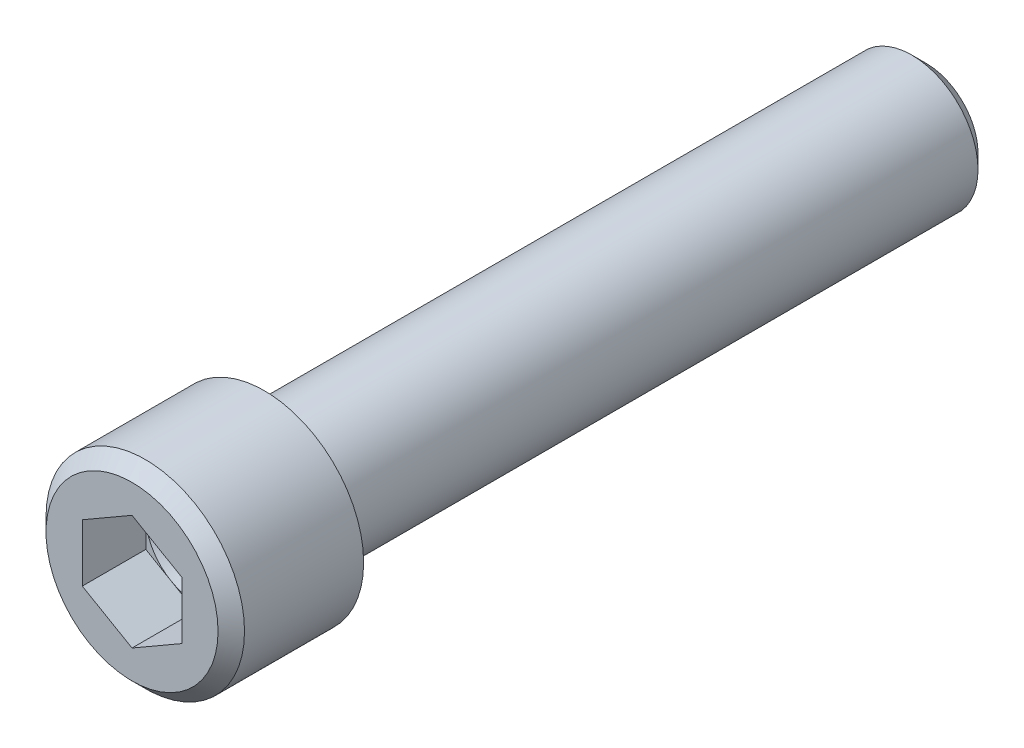
ISO-10303-21;
HEADER;
FILE_DESCRIPTION(('STEP AP214'),'2;1');
FILE_NAME('part.step','',(''),(''),'','','');
FILE_SCHEMA(('AUTOMOTIVE_DESIGN { 1 0 10303 214 1 1 1 1 }'));
ENDSEC;
DATA;
#1=APPLICATION_CONTEXT('core data for automotive mechanical design processes');
#2=APPLICATION_PROTOCOL_DEFINITION('international standard','automotive_design',2000,#1);
#3=PRODUCT_CONTEXT('',#1,'mechanical');
#4=PRODUCT('Part','Part','',(#3));
#5=PRODUCT_RELATED_PRODUCT_CATEGORY('part','',(#4));
#6=PRODUCT_DEFINITION_FORMATION('','',#4);
#7=PRODUCT_DEFINITION_CONTEXT('part definition',#1,'design');
#8=PRODUCT_DEFINITION('design','',#6,#7);
#9=PRODUCT_DEFINITION_SHAPE('','',#8);
#10=(LENGTH_UNIT() NAMED_UNIT(*) SI_UNIT(.MILLI.,.METRE.));
#11=(NAMED_UNIT(*) PLANE_ANGLE_UNIT() SI_UNIT($,.RADIAN.));
#12=(NAMED_UNIT(*) SI_UNIT($,.STERADIAN.) SOLID_ANGLE_UNIT());
#13=UNCERTAINTY_MEASURE_WITH_UNIT(LENGTH_MEASURE(1.E-05),#10,'distance_accuracy_value','');
#14=(GEOMETRIC_REPRESENTATION_CONTEXT(3) GLOBAL_UNCERTAINTY_ASSIGNED_CONTEXT((#13)) GLOBAL_UNIT_ASSIGNED_CONTEXT((#10,
#11,#12)) REPRESENTATION_CONTEXT('',''));
#15=CARTESIAN_POINT('',(0.,0.,0.));
#16=DIRECTION('',(0.,0.,1.));
#17=DIRECTION('',(1.,0.,0.));
#18=AXIS2_PLACEMENT_3D('',#15,#16,#17);
#19=CARTESIAN_POINT('',(0.,0.,3.302));
#20=DIRECTION('',(0.,0.,1.));
#21=DIRECTION('',(1.,0.,0.));
#22=AXIS2_PLACEMENT_3D('',#19,#20,#21);
#23=PLANE('',#22);
#24=DIRECTION('',(0.,1.,0.));
#25=VECTOR('',#24,1.);
#26=CARTESIAN_POINT('',(-2.3876,0.,3.302));
#27=LINE('',#26,#25);
#28=CARTESIAN_POINT('',(-2.3876,0.,3.302));
#29=VERTEX_POINT('',#28);
#30=CARTESIAN_POINT('',(-2.3876,1.37848150271715,3.302));
#31=VERTEX_POINT('',#30);
#32=EDGE_CURVE('E346',#29,#31,#27,.T.);
#33=ORIENTED_EDGE('',*,*,#32,.F.);
#34=CARTESIAN_POINT('',(0.,0.,3.302));
#35=DIRECTION('',(0.,0.,-1.));
#36=DIRECTION('',(-1.,0.,0.));
#37=AXIS2_PLACEMENT_3D('',#34,#35,#36);
#38=CIRCLE('',#37,2.3876);
#39=CARTESIAN_POINT('',(-1.1938,2.06772225407573,3.302));
#40=VERTEX_POINT('',#39);
#41=EDGE_CURVE('E32',#29,#40,#38,.T.);
#42=ORIENTED_EDGE('',*,*,#41,.T.);
#43=DIRECTION('',(0.866025403784438,0.5,0.));
#44=VECTOR('',#43,1.);
#45=CARTESIAN_POINT('',(-1.1938,2.06772225407573,3.302));
#46=LINE('',#45,#44);
#47=EDGE_CURVE('E342',#31,#40,#46,.T.);
#48=ORIENTED_EDGE('',*,*,#47,.F.);
#49=EDGE_LOOP('',(#33,#42,#48));
#50=FACE_BOUND('',#49,.T.);
#51=ADVANCED_FACE('F17',(#50),#23,.T.);
#52=CARTESIAN_POINT('',(0.,2.7569630054343,3.302));
#53=VERTEX_POINT('',#52);
#54=EDGE_CURVE('E341',#40,#53,#46,.T.);
#55=ORIENTED_EDGE('',*,*,#54,.F.);
#56=CARTESIAN_POINT('',(1.1938,2.06772225407573,3.302));
#57=VERTEX_POINT('',#56);
#58=EDGE_CURVE('E205',#40,#57,#38,.T.);
#59=ORIENTED_EDGE('',*,*,#58,.T.);
#60=DIRECTION('',(0.866025403784439,-0.5,0.));
#61=VECTOR('',#60,1.);
#62=CARTESIAN_POINT('',(1.1938,2.06772225407573,3.302));
#63=LINE('',#62,#61);
#64=EDGE_CURVE('E334',#53,#57,#63,.T.);
#65=ORIENTED_EDGE('',*,*,#64,.F.);
#66=EDGE_LOOP('',(#55,#59,#65));
#67=FACE_BOUND('',#66,.T.);
#68=ADVANCED_FACE('F105',(#67),#23,.T.);
#69=CARTESIAN_POINT('',(2.3876,1.37848150271715,3.302));
#70=VERTEX_POINT('',#69);
#71=EDGE_CURVE('E180',#57,#70,#63,.T.);
#72=ORIENTED_EDGE('',*,*,#71,.F.);
#73=CARTESIAN_POINT('',(2.3876,0.,3.302));
#74=VERTEX_POINT('',#73);
#75=EDGE_CURVE('E332',#57,#74,#38,.T.);
#76=ORIENTED_EDGE('',*,*,#75,.T.);
#77=DIRECTION('',(0.,-1.,0.));
#78=VECTOR('',#77,1.);
#79=CARTESIAN_POINT('',(2.3876,0.,3.302));
#80=LINE('',#79,#78);
#81=EDGE_CURVE('E157',#70,#74,#80,.T.);
#82=ORIENTED_EDGE('',*,*,#81,.F.);
#83=EDGE_LOOP('',(#72,#76,#82));
#84=FACE_BOUND('',#83,.T.);
#85=ADVANCED_FACE('F112',(#84),#23,.T.);
#86=CARTESIAN_POINT('',(2.3876,-1.37848150271715,3.302));
#87=VERTEX_POINT('',#86);
#88=EDGE_CURVE('E156',#74,#87,#80,.T.);
#89=ORIENTED_EDGE('',*,*,#88,.F.);
#90=CARTESIAN_POINT('',(1.1938,-2.06772225407573,3.302));
#91=VERTEX_POINT('',#90);
#92=EDGE_CURVE('E359',#74,#91,#38,.T.);
#93=ORIENTED_EDGE('',*,*,#92,.T.);
#94=DIRECTION('',(-0.866025403784439,-0.5,0.));
#95=VECTOR('',#94,1.);
#96=CARTESIAN_POINT('',(1.1938,-2.06772225407573,3.302));
#97=LINE('',#96,#95);
#98=EDGE_CURVE('E150',#87,#91,#97,.T.);
#99=ORIENTED_EDGE('',*,*,#98,.F.);
#100=EDGE_LOOP('',(#89,#93,#99));
#101=FACE_BOUND('',#100,.T.);
#102=ADVANCED_FACE('F131',(#101),#23,.T.);
#103=CARTESIAN_POINT('',(0.,-2.7569630054343,3.302));
#104=VERTEX_POINT('',#103);
#105=EDGE_CURVE('E144',#91,#104,#97,.T.);
#106=ORIENTED_EDGE('',*,*,#105,.F.);
#107=CARTESIAN_POINT('',(-1.1938,-2.06772225407573,3.302));
#108=VERTEX_POINT('',#107);
#109=EDGE_CURVE('E146',#91,#108,#38,.T.);
#110=ORIENTED_EDGE('',*,*,#109,.T.);
#111=DIRECTION('',(-0.866025403784439,0.5,0.));
#112=VECTOR('',#111,1.);
#113=CARTESIAN_POINT('',(-1.1938,-2.06772225407573,3.302));
#114=LINE('',#113,#112);
#115=EDGE_CURVE('E148',#104,#108,#114,.T.);
#116=ORIENTED_EDGE('',*,*,#115,.F.);
#117=EDGE_LOOP('',(#106,#110,#116));
#118=FACE_BOUND('',#117,.T.);
#119=ADVANCED_FACE('F120',(#118),#23,.T.);
#120=CARTESIAN_POINT('',(0.,0.,6.35));
#121=DIRECTION('',(0.,0.,1.));
#122=DIRECTION('',(1.,0.,0.));
#123=AXIS2_PLACEMENT_3D('',#120,#121,#122);
#124=PLANE('',#123);
#125=CARTESIAN_POINT('',(0.,0.,6.35));
#126=DIRECTION('',(0.,0.,1.));
#127=DIRECTION('',(1.,0.,0.));
#128=AXIS2_PLACEMENT_3D('',#125,#126,#127);
#129=CIRCLE('',#128,4.1275);
#130=CARTESIAN_POINT('',(4.1275,0.,6.35));
#131=VERTEX_POINT('',#130);
#132=EDGE_CURVE('E194',#131,#131,#129,.T.);
#133=ORIENTED_EDGE('',*,*,#132,.T.);
#134=EDGE_LOOP('',(#133));
#135=FACE_BOUND('',#134,.T.);
#136=DIRECTION('',(0.866025403784438,0.5,0.));
#137=VECTOR('',#136,1.);
#138=CARTESIAN_POINT('',(-1.1938,2.06772225407573,6.35));
#139=LINE('',#138,#137);
#140=CARTESIAN_POINT('',(-2.3876,1.37848150271715,6.35));
#141=VERTEX_POINT('',#140);
#142=CARTESIAN_POINT('',(0.,2.7569630054343,6.35));
#143=VERTEX_POINT('',#142);
#144=EDGE_CURVE('E167',#141,#143,#139,.T.);
#145=ORIENTED_EDGE('',*,*,#144,.T.);
#146=DIRECTION('',(0.866025403784439,-0.5,0.));
#147=VECTOR('',#146,1.);
#148=CARTESIAN_POINT('',(1.1938,2.06772225407573,6.35));
#149=LINE('',#148,#147);
#150=CARTESIAN_POINT('',(2.3876,1.37848150271715,6.35));
#151=VERTEX_POINT('',#150);
#152=EDGE_CURVE('E164',#143,#151,#149,.T.);
#153=ORIENTED_EDGE('',*,*,#152,.T.);
#154=DIRECTION('',(0.,-1.,0.));
#155=VECTOR('',#154,1.);
#156=CARTESIAN_POINT('',(2.3876,0.,6.35));
#157=LINE('',#156,#155);
#158=CARTESIAN_POINT('',(2.3876,-1.37848150271715,6.35));
#159=VERTEX_POINT('',#158);
#160=EDGE_CURVE('E177',#151,#159,#157,.T.);
#161=ORIENTED_EDGE('',*,*,#160,.T.);
#162=DIRECTION('',(-0.866025403784439,-0.5,0.));
#163=VECTOR('',#162,1.);
#164=CARTESIAN_POINT('',(1.1938,-2.06772225407573,6.35));
#165=LINE('',#164,#163);
#166=CARTESIAN_POINT('',(0.,-2.7569630054343,6.35));
#167=VERTEX_POINT('',#166);
#168=EDGE_CURVE('E40',#159,#167,#165,.T.);
#169=ORIENTED_EDGE('',*,*,#168,.T.);
#170=DIRECTION('',(-0.866025403784439,0.5,0.));
#171=VECTOR('',#170,1.);
#172=CARTESIAN_POINT('',(-1.1938,-2.06772225407573,6.35));
#173=LINE('',#172,#171);
#174=CARTESIAN_POINT('',(-2.3876,-1.37848150271715,6.35));
#175=VERTEX_POINT('',#174);
#176=EDGE_CURVE('E173',#167,#175,#173,.T.);
#177=ORIENTED_EDGE('',*,*,#176,.T.);
#178=DIRECTION('',(0.,1.,0.));
#179=VECTOR('',#178,1.);
#180=CARTESIAN_POINT('',(-2.3876,0.,6.35));
#181=LINE('',#180,#179);
#182=EDGE_CURVE('E170',#175,#141,#181,.T.);
#183=ORIENTED_EDGE('',*,*,#182,.T.);
#184=EDGE_LOOP('',(#145,#153,#161,#169,#177,#183));
#185=FACE_BOUND('',#184,.T.);
#186=ADVANCED_FACE('F130',(#135,#185),#124,.T.);
#187=CARTESIAN_POINT('',(0.,0.,6.35));
#188=DIRECTION('',(0.,0.,-1.));
#189=DIRECTION('',(-1.,0.,0.));
#190=AXIS2_PLACEMENT_3D('',#187,#188,#189);
#191=CYLINDRICAL_SURFACE('',#190,4.7625);
#192=CARTESIAN_POINT('',(0.,0.,5.715));
#193=DIRECTION('',(0.,0.,1.));
#194=DIRECTION('',(1.,0.,0.));
#195=AXIS2_PLACEMENT_3D('',#192,#193,#194);
#196=CIRCLE('',#195,4.7625);
#197=CARTESIAN_POINT('',(4.7625,0.,5.715));
#198=VERTEX_POINT('',#197);
#199=EDGE_CURVE('E197',#198,#198,#196,.F.);
#200=ORIENTED_EDGE('',*,*,#199,.T.);
#201=EDGE_LOOP('',(#200));
#202=FACE_BOUND('',#201,.T.);
#203=CARTESIAN_POINT('',(0.,0.,0.));
#204=DIRECTION('',(0.,0.,1.));
#205=DIRECTION('',(1.,0.,0.));
#206=AXIS2_PLACEMENT_3D('',#203,#204,#205);
#207=CIRCLE('',#206,4.7625);
#208=CARTESIAN_POINT('',(4.7625,0.,0.));
#209=VERTEX_POINT('',#208);
#210=EDGE_CURVE('E191',#209,#209,#207,.T.);
#211=ORIENTED_EDGE('',*,*,#210,.T.);
#212=EDGE_LOOP('',(#211));
#213=FACE_BOUND('',#212,.T.);
#214=ADVANCED_FACE('F137',(#202,#213),#191,.T.);
#215=CARTESIAN_POINT('',(0.,0.,0.));
#216=DIRECTION('',(0.,0.,1.));
#217=DIRECTION('',(1.,0.,0.));
#218=AXIS2_PLACEMENT_3D('',#215,#216,#217);
#219=PLANE('',#218);
#220=CARTESIAN_POINT('',(0.,0.,0.));
#221=DIRECTION('',(0.,0.,1.));
#222=DIRECTION('',(1.,0.,0.));
#223=AXIS2_PLACEMENT_3D('',#220,#221,#222);
#224=CIRCLE('',#223,3.3528);
#225=CARTESIAN_POINT('',(3.3528,0.,0.));
#226=VERTEX_POINT('',#225);
#227=EDGE_CURVE('E204',#226,#226,#224,.T.);
#228=ORIENTED_EDGE('',*,*,#227,.T.);
#229=EDGE_LOOP('',(#228));
#230=FACE_BOUND('',#229,.T.);
#231=ORIENTED_EDGE('',*,*,#210,.F.);
#232=EDGE_LOOP('',(#231));
#233=FACE_BOUND('',#232,.T.);
#234=ADVANCED_FACE('F289',(#230,#233),#219,.F.);
#235=CARTESIAN_POINT('',(0.,0.,6.35));
#236=DIRECTION('',(0.,0.,-1.));
#237=DIRECTION('',(-1.,0.,0.));
#238=AXIS2_PLACEMENT_3D('',#235,#236,#237);
#239=CONICAL_SURFACE('',#238,4.1275,0.785398163397448);
#240=ORIENTED_EDGE('',*,*,#199,.F.);
#241=EDGE_LOOP('',(#240));
#242=FACE_BOUND('',#241,.T.);
#243=ORIENTED_EDGE('',*,*,#132,.F.);
#244=EDGE_LOOP('',(#243));
#245=FACE_BOUND('',#244,.T.);
#246=ADVANCED_FACE('F281',(#242,#245),#239,.T.);
#247=CARTESIAN_POINT('',(1.1938,2.06772225407573,3.302));
#248=DIRECTION('',(-0.5,-0.866025403784439,0.));
#249=DIRECTION('',(0.866025403784439,-0.5,0.));
#250=AXIS2_PLACEMENT_3D('',#247,#248,#249);
#251=PLANE('',#250);
#252=ORIENTED_EDGE('',*,*,#152,.F.);
#253=DIRECTION('',(0.,0.,1.));
#254=VECTOR('',#253,1.);
#255=CARTESIAN_POINT('',(0.,2.7569630054343,3.302));
#256=LINE('',#255,#254);
#257=EDGE_CURVE('E189',#53,#143,#256,.T.);
#258=ORIENTED_EDGE('',*,*,#257,.F.);
#259=ORIENTED_EDGE('',*,*,#64,.T.);
#260=ORIENTED_EDGE('',*,*,#71,.T.);
#261=DIRECTION('',(0.,0.,1.));
#262=VECTOR('',#261,1.);
#263=CARTESIAN_POINT('',(2.3876,1.37848150271715,3.302));
#264=LINE('',#263,#262);
#265=EDGE_CURVE('E163',#70,#151,#264,.T.);
#266=ORIENTED_EDGE('',*,*,#265,.T.);
#267=EDGE_LOOP('',(#252,#258,#259,#260,#266));
#268=FACE_BOUND('',#267,.T.);
#269=ADVANCED_FACE('F273',(#268),#251,.T.);
#270=CARTESIAN_POINT('',(-1.1938,2.06772225407573,3.302));
#271=DIRECTION('',(0.5,-0.866025403784438,0.));
#272=DIRECTION('',(0.866025403784438,0.5,0.));
#273=AXIS2_PLACEMENT_3D('',#270,#271,#272);
#274=PLANE('',#273);
#275=ORIENTED_EDGE('',*,*,#144,.F.);
#276=DIRECTION('',(0.,0.,1.));
#277=VECTOR('',#276,1.);
#278=CARTESIAN_POINT('',(-2.3876,1.37848150271715,3.302));
#279=LINE('',#278,#277);
#280=EDGE_CURVE('E187',#31,#141,#279,.T.);
#281=ORIENTED_EDGE('',*,*,#280,.F.);
#282=ORIENTED_EDGE('',*,*,#47,.T.);
#283=ORIENTED_EDGE('',*,*,#54,.T.);
#284=ORIENTED_EDGE('',*,*,#257,.T.);
#285=EDGE_LOOP('',(#275,#281,#282,#283,#284));
#286=FACE_BOUND('',#285,.T.);
#287=ADVANCED_FACE('F265',(#286),#274,.T.);
#288=CARTESIAN_POINT('',(-2.3876,0.,3.302));
#289=DIRECTION('',(1.,0.,0.));
#290=DIRECTION('',(0.,1.,0.));
#291=AXIS2_PLACEMENT_3D('',#288,#289,#290);
#292=PLANE('',#291);
#293=ORIENTED_EDGE('',*,*,#182,.F.);
#294=DIRECTION('',(0.,0.,1.));
#295=VECTOR('',#294,1.);
#296=CARTESIAN_POINT('',(-2.3876,-1.37848150271715,3.302));
#297=LINE('',#296,#295);
#298=CARTESIAN_POINT('',(-2.3876,-1.37848150271715,3.302));
#299=VERTEX_POINT('',#298);
#300=EDGE_CURVE('E185',#299,#175,#297,.T.);
#301=ORIENTED_EDGE('',*,*,#300,.F.);
#302=EDGE_CURVE('E347',#299,#29,#27,.T.);
#303=ORIENTED_EDGE('',*,*,#302,.T.);
#304=ORIENTED_EDGE('',*,*,#32,.T.);
#305=ORIENTED_EDGE('',*,*,#280,.T.);
#306=EDGE_LOOP('',(#293,#301,#303,#304,#305));
#307=FACE_BOUND('',#306,.T.);
#308=ADVANCED_FACE('F257',(#307),#292,.T.);
#309=CARTESIAN_POINT('',(-1.1938,-2.06772225407573,3.302));
#310=DIRECTION('',(0.5,0.866025403784439,0.));
#311=DIRECTION('',(-0.866025403784439,0.5,0.));
#312=AXIS2_PLACEMENT_3D('',#309,#310,#311);
#313=PLANE('',#312);
#314=ORIENTED_EDGE('',*,*,#176,.F.);
#315=DIRECTION('',(0.,0.,1.));
#316=VECTOR('',#315,1.);
#317=CARTESIAN_POINT('',(0.,-2.7569630054343,3.302));
#318=LINE('',#317,#316);
#319=EDGE_CURVE('E183',#104,#167,#318,.T.);
#320=ORIENTED_EDGE('',*,*,#319,.F.);
#321=ORIENTED_EDGE('',*,*,#115,.T.);
#322=EDGE_CURVE('E349',#108,#299,#114,.T.);
#323=ORIENTED_EDGE('',*,*,#322,.T.);
#324=ORIENTED_EDGE('',*,*,#300,.T.);
#325=EDGE_LOOP('',(#314,#320,#321,#323,#324));
#326=FACE_BOUND('',#325,.T.);
#327=ADVANCED_FACE('F250',(#326),#313,.T.);
#328=CARTESIAN_POINT('',(1.1938,-2.06772225407573,3.302));
#329=DIRECTION('',(-0.5,0.866025403784439,0.));
#330=DIRECTION('',(-0.866025403784439,-0.5,0.));
#331=AXIS2_PLACEMENT_3D('',#328,#329,#330);
#332=PLANE('',#331);
#333=ORIENTED_EDGE('',*,*,#168,.F.);
#334=DIRECTION('',(0.,0.,1.));
#335=VECTOR('',#334,1.);
#336=CARTESIAN_POINT('',(2.3876,-1.37848150271715,3.302));
#337=LINE('',#336,#335);
#338=EDGE_CURVE('E153',#87,#159,#337,.T.);
#339=ORIENTED_EDGE('',*,*,#338,.F.);
#340=ORIENTED_EDGE('',*,*,#98,.T.);
#341=ORIENTED_EDGE('',*,*,#105,.T.);
#342=ORIENTED_EDGE('',*,*,#319,.T.);
#343=EDGE_LOOP('',(#333,#339,#340,#341,#342));
#344=FACE_BOUND('',#343,.T.);
#345=ADVANCED_FACE('F126',(#344),#332,.T.);
#346=CARTESIAN_POINT('',(2.3876,0.,3.302));
#347=DIRECTION('',(-1.,0.,0.));
#348=DIRECTION('',(0.,0.,1.));
#349=AXIS2_PLACEMENT_3D('',#346,#347,#348);
#350=PLANE('',#349);
#351=ORIENTED_EDGE('',*,*,#160,.F.);
#352=ORIENTED_EDGE('',*,*,#265,.F.);
#353=ORIENTED_EDGE('',*,*,#81,.T.);
#354=ORIENTED_EDGE('',*,*,#88,.T.);
#355=ORIENTED_EDGE('',*,*,#338,.T.);
#356=EDGE_LOOP('',(#351,#352,#353,#354,#355));
#357=FACE_BOUND('',#356,.T.);
#358=ADVANCED_FACE('F118',(#357),#350,.T.);
#359=ORIENTED_EDGE('',*,*,#322,.F.);
#360=EDGE_CURVE('E200',#108,#29,#38,.T.);
#361=ORIENTED_EDGE('',*,*,#360,.T.);
#362=ORIENTED_EDGE('',*,*,#302,.F.);
#363=EDGE_LOOP('',(#359,#361,#362));
#364=FACE_BOUND('',#363,.T.);
#365=ADVANCED_FACE('F108',(#364),#23,.T.);
#366=CARTESIAN_POINT('',(0.,0.,-31.75));
#367=DIRECTION('',(0.,0.,1.));
#368=DIRECTION('',(1.,0.,0.));
#369=AXIS2_PLACEMENT_3D('',#366,#367,#368);
#370=CYLINDRICAL_SURFACE('',#369,3.175);
#371=CARTESIAN_POINT('',(0.,0.,-31.06259233875));
#372=DIRECTION('',(0.,0.,-1.));
#373=DIRECTION('',(-1.,0.,0.));
#374=AXIS2_PLACEMENT_3D('',#371,#372,#373);
#375=CIRCLE('',#374,3.175);
#376=CARTESIAN_POINT('',(-3.175,0.,-31.06259233875));
#377=VERTEX_POINT('',#376);
#378=EDGE_CURVE('E11',#377,#377,#375,.F.);
#379=ORIENTED_EDGE('',*,*,#378,.T.);
#380=EDGE_LOOP('',(#379));
#381=FACE_BOUND('',#380,.T.);
#382=CARTESIAN_POINT('',(0.,0.,-0.1778));
#383=DIRECTION('',(0.,0.,1.));
#384=DIRECTION('',(1.,0.,0.));
#385=AXIS2_PLACEMENT_3D('',#382,#383,#384);
#386=CIRCLE('',#385,3.175);
#387=CARTESIAN_POINT('',(3.175,0.,-0.1778));
#388=VERTEX_POINT('',#387);
#389=EDGE_CURVE('E201',#388,#388,#386,.F.);
#390=ORIENTED_EDGE('',*,*,#389,.T.);
#391=EDGE_LOOP('',(#390));
#392=FACE_BOUND('',#391,.T.);
#393=ADVANCED_FACE('F101',(#381,#392),#370,.T.);
#394=CARTESIAN_POINT('',(0.,0.,-31.75));
#395=DIRECTION('',(0.,0.,-1.));
#396=DIRECTION('',(1.,0.,0.));
#397=AXIS2_PLACEMENT_3D('',#394,#395,#396);
#398=PLANE('',#397);
#399=CARTESIAN_POINT('',(0.,0.,-31.75));
#400=DIRECTION('',(0.,0.,-1.));
#401=DIRECTION('',(-1.,0.,0.));
#402=AXIS2_PLACEMENT_3D('',#399,#400,#401);
#403=CIRCLE('',#402,2.48759233875);
#404=CARTESIAN_POINT('',(-2.48759233875,0.,-31.75));
#405=VERTEX_POINT('',#404);
#406=EDGE_CURVE('E25',#405,#405,#403,.T.);
#407=ORIENTED_EDGE('',*,*,#406,.T.);
#408=EDGE_LOOP('',(#407));
#409=FACE_BOUND('',#408,.T.);
#410=ADVANCED_FACE('F93',(#409),#398,.T.);
#411=CARTESIAN_POINT('',(0.,0.,1.92351849728284));
#412=DIRECTION('',(0.,0.,1.));
#413=DIRECTION('',(1.,0.,0.));
#414=AXIS2_PLACEMENT_3D('',#411,#412,#413);
#415=CONICAL_SURFACE('',#414,0.,1.0471975511966);
#416=ORIENTED_EDGE('',*,*,#41,.F.);
#417=ORIENTED_EDGE('',*,*,#360,.F.);
#418=ORIENTED_EDGE('',*,*,#109,.F.);
#419=ORIENTED_EDGE('',*,*,#92,.F.);
#420=ORIENTED_EDGE('',*,*,#75,.F.);
#421=ORIENTED_EDGE('',*,*,#58,.F.);
#422=EDGE_LOOP('',(#416,#417,#418,#419,#420,#421));
#423=FACE_BOUND('',#422,.T.);
#424=CARTESIAN_POINT('',(0.,0.,1.92351849728284));
#425=VERTEX_POINT('',#424);
#426=VERTEX_LOOP('',#425);
#427=FACE_BOUND('',#426,.T.);
#428=ADVANCED_FACE('F90',(#423,#427),#415,.F.);
#429=CARTESIAN_POINT('',(0.,0.,-0.1778));
#430=DIRECTION('',(0.,0.,1.));
#431=DIRECTION('',(1.,0.,0.));
#432=AXIS2_PLACEMENT_3D('',#429,#430,#431);
#433=TOROIDAL_SURFACE('',#432,3.3528,0.1778);
#434=ORIENTED_EDGE('',*,*,#227,.F.);
#435=EDGE_LOOP('',(#434));
#436=FACE_BOUND('',#435,.T.);
#437=ORIENTED_EDGE('',*,*,#389,.F.);
#438=EDGE_LOOP('',(#437));
#439=FACE_BOUND('',#438,.T.);
#440=ADVANCED_FACE('F92',(#436,#439),#433,.F.);
#441=CARTESIAN_POINT('',(0.,0.,-31.75));
#442=DIRECTION('',(0.,0.,1.));
#443=DIRECTION('',(1.,0.,0.));
#444=AXIS2_PLACEMENT_3D('',#441,#442,#443);
#445=CONICAL_SURFACE('',#444,2.48759233875,0.785398163397448);
#446=ORIENTED_EDGE('',*,*,#378,.F.);
#447=EDGE_LOOP('',(#446));
#448=FACE_BOUND('',#447,.T.);
#449=ORIENTED_EDGE('',*,*,#406,.F.);
#450=EDGE_LOOP('',(#449));
#451=FACE_BOUND('',#450,.T.);
#452=ADVANCED_FACE('F19',(#448,#451),#445,.T.);
#453=CLOSED_SHELL('',(#51,#68,#85,#102,#119,#186,#214,#234,#246,#269,#287,#308,#327,#345,#358,
#365,#393,#410,#428,#440,#452));
#454=MANIFOLD_SOLID_BREP('B1',#453);
#455=ADVANCED_BREP_SHAPE_REPRESENTATION('',(#18,#454),#14);
#456=SHAPE_DEFINITION_REPRESENTATION(#9,#455);
ENDSEC;
END-ISO-10303-21;
